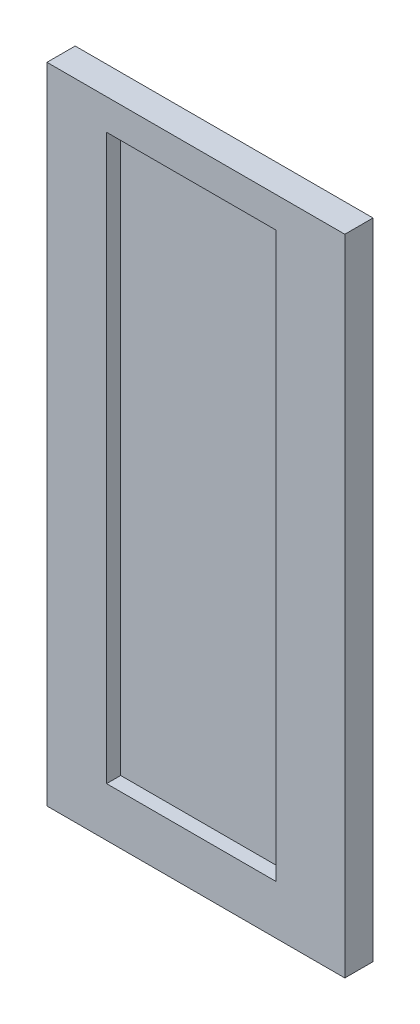
ISO-10303-21;
HEADER;
FILE_DESCRIPTION(('STEP AP214'),'2;1');
FILE_NAME('part.step','',(''),(''),'','','');
FILE_SCHEMA(('AUTOMOTIVE_DESIGN { 1 0 10303 214 1 1 1 1 }'));
ENDSEC;
DATA;
#1=APPLICATION_CONTEXT('core data for automotive mechanical design processes');
#2=APPLICATION_PROTOCOL_DEFINITION('international standard','automotive_design',2000,#1);
#3=PRODUCT_CONTEXT('',#1,'mechanical');
#4=PRODUCT('Part','Part','',(#3));
#5=PRODUCT_RELATED_PRODUCT_CATEGORY('part','',(#4));
#6=PRODUCT_DEFINITION_FORMATION('','',#4);
#7=PRODUCT_DEFINITION_CONTEXT('part definition',#1,'design');
#8=PRODUCT_DEFINITION('design','',#6,#7);
#9=PRODUCT_DEFINITION_SHAPE('','',#8);
#10=(LENGTH_UNIT() NAMED_UNIT(*) SI_UNIT(.MILLI.,.METRE.));
#11=(NAMED_UNIT(*) PLANE_ANGLE_UNIT() SI_UNIT($,.RADIAN.));
#12=(NAMED_UNIT(*) SI_UNIT($,.STERADIAN.) SOLID_ANGLE_UNIT());
#13=UNCERTAINTY_MEASURE_WITH_UNIT(LENGTH_MEASURE(1.E-05),#10,'distance_accuracy_value','');
#14=(GEOMETRIC_REPRESENTATION_CONTEXT(3) GLOBAL_UNCERTAINTY_ASSIGNED_CONTEXT((#13)) GLOBAL_UNIT_ASSIGNED_CONTEXT((#10,
#11,#12)) REPRESENTATION_CONTEXT('',''));
#15=CARTESIAN_POINT('',(0.,0.,0.));
#16=DIRECTION('',(0.,0.,1.));
#17=DIRECTION('',(1.,0.,0.));
#18=AXIS2_PLACEMENT_3D('',#15,#16,#17);
#19=CARTESIAN_POINT('',(-10.5676357049356,-108.722534952028,-5.));
#20=DIRECTION('',(-1.,0.,0.));
#21=DIRECTION('',(0.,0.,1.));
#22=AXIS2_PLACEMENT_3D('',#19,#20,#21);
#23=PLANE('',#22);
#24=DIRECTION('',(0.,-1.,0.));
#25=VECTOR('',#24,1.);
#26=CARTESIAN_POINT('',(-10.5676357049356,-108.722534952028,0.));
#27=LINE('',#26,#25);
#28=CARTESIAN_POINT('',(-10.5676357049356,5.45936548567067,0.));
#29=VERTEX_POINT('',#28);
#30=CARTESIAN_POINT('',(-10.5676357049356,-108.722534952028,0.));
#31=VERTEX_POINT('',#30);
#32=EDGE_CURVE('E150',#29,#31,#27,.T.);
#33=ORIENTED_EDGE('',*,*,#32,.F.);
#34=DIRECTION('',(0.,0.,1.));
#35=VECTOR('',#34,1.);
#36=CARTESIAN_POINT('',(-10.5676357049356,5.45936548567067,-5.));
#37=LINE('',#36,#35);
#38=CARTESIAN_POINT('',(-10.5676357049356,5.45936548567067,-5.));
#39=VERTEX_POINT('',#38);
#40=EDGE_CURVE('E11',#39,#29,#37,.T.);
#41=ORIENTED_EDGE('',*,*,#40,.F.);
#42=DIRECTION('',(0.,-1.,0.));
#43=VECTOR('',#42,1.);
#44=CARTESIAN_POINT('',(-10.5676357049356,-108.722534952028,-5.));
#45=LINE('',#44,#43);
#46=CARTESIAN_POINT('',(-10.5676357049356,-108.722534952028,-5.));
#47=VERTEX_POINT('',#46);
#48=EDGE_CURVE('E154',#39,#47,#45,.T.);
#49=ORIENTED_EDGE('',*,*,#48,.T.);
#50=DIRECTION('',(0.,0.,1.));
#51=VECTOR('',#50,1.);
#52=CARTESIAN_POINT('',(-10.5676357049356,-108.722534952028,-5.));
#53=LINE('',#52,#51);
#54=EDGE_CURVE('E45',#47,#31,#53,.T.);
#55=ORIENTED_EDGE('',*,*,#54,.T.);
#56=EDGE_LOOP('',(#33,#41,#49,#55));
#57=FACE_BOUND('',#56,.T.);
#58=ADVANCED_FACE('F42',(#57),#23,.T.);
#59=CARTESIAN_POINT('',(-10.5676357049356,5.45936548567067,-5.));
#60=DIRECTION('',(0.,1.,0.));
#61=DIRECTION('',(0.,0.,1.));
#62=AXIS2_PLACEMENT_3D('',#59,#60,#61);
#63=PLANE('',#62);
#64=DIRECTION('',(-1.,0.,0.));
#65=VECTOR('',#64,1.);
#66=CARTESIAN_POINT('',(-10.5676357049356,5.45936548567067,0.));
#67=LINE('',#66,#65);
#68=CARTESIAN_POINT('',(42.2321698369315,5.45936548567067,0.));
#69=VERTEX_POINT('',#68);
#70=EDGE_CURVE('E157',#69,#29,#67,.T.);
#71=ORIENTED_EDGE('',*,*,#70,.F.);
#72=DIRECTION('',(0.,0.,1.));
#73=VECTOR('',#72,1.);
#74=CARTESIAN_POINT('',(42.2321698369315,5.45936548567067,-5.));
#75=LINE('',#74,#73);
#76=CARTESIAN_POINT('',(42.2321698369315,5.45936548567067,-5.));
#77=VERTEX_POINT('',#76);
#78=EDGE_CURVE('E50',#77,#69,#75,.T.);
#79=ORIENTED_EDGE('',*,*,#78,.F.);
#80=DIRECTION('',(-1.,0.,0.));
#81=VECTOR('',#80,1.);
#82=CARTESIAN_POINT('',(-10.5676357049356,5.45936548567067,-5.));
#83=LINE('',#82,#81);
#84=EDGE_CURVE('E162',#77,#39,#83,.T.);
#85=ORIENTED_EDGE('',*,*,#84,.T.);
#86=ORIENTED_EDGE('',*,*,#40,.T.);
#87=EDGE_LOOP('',(#71,#79,#85,#86));
#88=FACE_BOUND('',#87,.T.);
#89=ADVANCED_FACE('F179',(#88),#63,.T.);
#90=CARTESIAN_POINT('',(42.2321698369315,5.45936548567067,-5.));
#91=DIRECTION('',(1.,0.,0.));
#92=DIRECTION('',(0.,0.,-1.));
#93=AXIS2_PLACEMENT_3D('',#90,#91,#92);
#94=PLANE('',#93);
#95=DIRECTION('',(0.,1.,0.));
#96=VECTOR('',#95,1.);
#97=CARTESIAN_POINT('',(42.2321698369315,5.45936548567067,0.));
#98=LINE('',#97,#96);
#99=CARTESIAN_POINT('',(42.2321698369315,-108.722534952028,0.));
#100=VERTEX_POINT('',#99);
#101=EDGE_CURVE('E169',#100,#69,#98,.T.);
#102=ORIENTED_EDGE('',*,*,#101,.F.);
#103=DIRECTION('',(0.,0.,1.));
#104=VECTOR('',#103,1.);
#105=CARTESIAN_POINT('',(42.2321698369315,-108.722534952028,-5.));
#106=LINE('',#105,#104);
#107=CARTESIAN_POINT('',(42.2321698369315,-108.722534952028,-5.));
#108=VERTEX_POINT('',#107);
#109=EDGE_CURVE('E174',#108,#100,#106,.T.);
#110=ORIENTED_EDGE('',*,*,#109,.F.);
#111=DIRECTION('',(0.,1.,0.));
#112=VECTOR('',#111,1.);
#113=CARTESIAN_POINT('',(42.2321698369315,5.45936548567067,-5.));
#114=LINE('',#113,#112);
#115=EDGE_CURVE('E159',#108,#77,#114,.T.);
#116=ORIENTED_EDGE('',*,*,#115,.T.);
#117=ORIENTED_EDGE('',*,*,#78,.T.);
#118=EDGE_LOOP('',(#102,#110,#116,#117));
#119=FACE_BOUND('',#118,.T.);
#120=ADVANCED_FACE('F183',(#119),#94,.T.);
#121=CARTESIAN_POINT('',(42.2321698369315,-108.722534952028,-5.));
#122=DIRECTION('',(0.,-1.,0.));
#123=DIRECTION('',(1.,0.,0.));
#124=AXIS2_PLACEMENT_3D('',#121,#122,#123);
#125=PLANE('',#124);
#126=DIRECTION('',(1.,0.,0.));
#127=VECTOR('',#126,1.);
#128=CARTESIAN_POINT('',(42.2321698369315,-108.722534952028,0.));
#129=LINE('',#128,#127);
#130=EDGE_CURVE('E166',#31,#100,#129,.T.);
#131=ORIENTED_EDGE('',*,*,#130,.F.);
#132=ORIENTED_EDGE('',*,*,#54,.F.);
#133=DIRECTION('',(1.,0.,0.));
#134=VECTOR('',#133,1.);
#135=CARTESIAN_POINT('',(42.2321698369315,-108.722534952028,-5.));
#136=LINE('',#135,#134);
#137=EDGE_CURVE('E156',#47,#108,#136,.T.);
#138=ORIENTED_EDGE('',*,*,#137,.T.);
#139=ORIENTED_EDGE('',*,*,#109,.T.);
#140=EDGE_LOOP('',(#131,#132,#138,#139));
#141=FACE_BOUND('',#140,.T.);
#142=ADVANCED_FACE('F176',(#141),#125,.T.);
#143=CARTESIAN_POINT('',(0.,0.,-5.));
#144=DIRECTION('',(0.,0.,-1.));
#145=DIRECTION('',(-1.,0.,0.));
#146=AXIS2_PLACEMENT_3D('',#143,#144,#145);
#147=PLANE('',#146);
#148=ORIENTED_EDGE('',*,*,#48,.F.);
#149=ORIENTED_EDGE('',*,*,#84,.F.);
#150=ORIENTED_EDGE('',*,*,#115,.F.);
#151=ORIENTED_EDGE('',*,*,#137,.F.);
#152=EDGE_LOOP('',(#148,#149,#150,#151));
#153=FACE_BOUND('',#152,.T.);
#154=ADVANCED_FACE('F185',(#153),#147,.T.);
#155=CARTESIAN_POINT('',(0.,0.,0.));
#156=DIRECTION('',(0.,0.,-1.));
#157=DIRECTION('',(-1.,0.,0.));
#158=AXIS2_PLACEMENT_3D('',#155,#156,#157);
#159=PLANE('',#158);
#160=DIRECTION('',(1.,0.,0.));
#161=VECTOR('',#160,1.);
#162=CARTESIAN_POINT('',(30.0000000000011,-99.9999999999998,0.));
#163=LINE('',#162,#161);
#164=CARTESIAN_POINT('',(1.13686838048077E-12,-100.,0.));
#165=VERTEX_POINT('',#164);
#166=CARTESIAN_POINT('',(30.0000000000011,-99.9999999999998,0.));
#167=VERTEX_POINT('',#166);
#168=EDGE_CURVE('E144',#165,#167,#163,.T.);
#169=ORIENTED_EDGE('',*,*,#168,.F.);
#170=DIRECTION('',(0.,-1.,0.));
#171=VECTOR('',#170,1.);
#172=CARTESIAN_POINT('',(1.13686837721616E-12,-100.,0.));
#173=LINE('',#172,#171);
#174=CARTESIAN_POINT('',(2.27373675443232E-13,-1.13686837721616E-13,0.));
#175=VERTEX_POINT('',#174);
#176=EDGE_CURVE('E58',#175,#165,#173,.T.);
#177=ORIENTED_EDGE('',*,*,#176,.F.);
#178=DIRECTION('',(-1.,0.,0.));
#179=VECTOR('',#178,1.);
#180=CARTESIAN_POINT('',(2.27373675443232E-13,-1.13686837721616E-13,0.));
#181=LINE('',#180,#179);
#182=CARTESIAN_POINT('',(30.0000000000002,2.27373675443232E-13,0.));
#183=VERTEX_POINT('',#182);
#184=EDGE_CURVE('E135',#183,#175,#181,.T.);
#185=ORIENTED_EDGE('',*,*,#184,.F.);
#186=DIRECTION('',(0.,1.,0.));
#187=VECTOR('',#186,1.);
#188=CARTESIAN_POINT('',(30.0000000000002,2.27373675443232E-13,0.));
#189=LINE('',#188,#187);
#190=EDGE_CURVE('E138',#167,#183,#189,.T.);
#191=ORIENTED_EDGE('',*,*,#190,.F.);
#192=EDGE_LOOP('',(#169,#177,#185,#191));
#193=FACE_BOUND('',#192,.T.);
#194=ORIENTED_EDGE('',*,*,#32,.T.);
#195=ORIENTED_EDGE('',*,*,#130,.T.);
#196=ORIENTED_EDGE('',*,*,#101,.T.);
#197=ORIENTED_EDGE('',*,*,#70,.T.);
#198=EDGE_LOOP('',(#194,#195,#196,#197));
#199=FACE_BOUND('',#198,.T.);
#200=ADVANCED_FACE('F178',(#193,#199),#159,.F.);
#201=CARTESIAN_POINT('',(1.13686837721616E-12,-100.,-2.5));
#202=DIRECTION('',(-1.,0.,0.));
#203=DIRECTION('',(0.,-1.,0.));
#204=AXIS2_PLACEMENT_3D('',#201,#202,#203);
#205=PLANE('',#204);
#206=ORIENTED_EDGE('',*,*,#176,.T.);
#207=DIRECTION('',(0.,0.,1.));
#208=VECTOR('',#207,1.);
#209=CARTESIAN_POINT('',(1.13686837721616E-12,-100.,-2.5));
#210=LINE('',#209,#208);
#211=CARTESIAN_POINT('',(1.13686837721616E-12,-100.,-2.5));
#212=VERTEX_POINT('',#211);
#213=EDGE_CURVE('E112',#212,#165,#210,.T.);
#214=ORIENTED_EDGE('',*,*,#213,.F.);
#215=DIRECTION('',(0.,-1.,0.));
#216=VECTOR('',#215,1.);
#217=CARTESIAN_POINT('',(1.13686837721616E-12,-100.,-2.5));
#218=LINE('',#217,#216);
#219=CARTESIAN_POINT('',(2.27373675443232E-13,-1.13686837721616E-13,-2.5));
#220=VERTEX_POINT('',#219);
#221=EDGE_CURVE('E116',#220,#212,#218,.T.);
#222=ORIENTED_EDGE('',*,*,#221,.F.);
#223=DIRECTION('',(0.,0.,1.));
#224=VECTOR('',#223,1.);
#225=CARTESIAN_POINT('',(2.27373675443232E-13,-1.13686837721616E-13,-2.5));
#226=LINE('',#225,#224);
#227=EDGE_CURVE('E148',#220,#175,#226,.T.);
#228=ORIENTED_EDGE('',*,*,#227,.T.);
#229=EDGE_LOOP('',(#206,#214,#222,#228));
#230=FACE_BOUND('',#229,.T.);
#231=ADVANCED_FACE('F114',(#230),#205,.F.);
#232=CARTESIAN_POINT('',(2.27373675443232E-13,-1.13686837721616E-13,-2.5));
#233=DIRECTION('',(0.,1.,0.));
#234=DIRECTION('',(-1.,0.,0.));
#235=AXIS2_PLACEMENT_3D('',#232,#233,#234);
#236=PLANE('',#235);
#237=ORIENTED_EDGE('',*,*,#184,.T.);
#238=ORIENTED_EDGE('',*,*,#227,.F.);
#239=DIRECTION('',(-1.,0.,0.));
#240=VECTOR('',#239,1.);
#241=CARTESIAN_POINT('',(2.27373675443232E-13,-1.13686837721616E-13,-2.5));
#242=LINE('',#241,#240);
#243=CARTESIAN_POINT('',(30.0000000000002,2.27373675443232E-13,-2.5));
#244=VERTEX_POINT('',#243);
#245=EDGE_CURVE('E122',#244,#220,#242,.T.);
#246=ORIENTED_EDGE('',*,*,#245,.F.);
#247=DIRECTION('',(0.,0.,1.));
#248=VECTOR('',#247,1.);
#249=CARTESIAN_POINT('',(30.0000000000002,2.27373675443232E-13,-2.5));
#250=LINE('',#249,#248);
#251=EDGE_CURVE('E151',#244,#183,#250,.T.);
#252=ORIENTED_EDGE('',*,*,#251,.T.);
#253=EDGE_LOOP('',(#237,#238,#246,#252));
#254=FACE_BOUND('',#253,.T.);
#255=ADVANCED_FACE('F231',(#254),#236,.F.);
#256=CARTESIAN_POINT('',(30.0000000000002,2.27373675443232E-13,-2.5));
#257=DIRECTION('',(1.,0.,0.));
#258=DIRECTION('',(0.,1.,0.));
#259=AXIS2_PLACEMENT_3D('',#256,#257,#258);
#260=PLANE('',#259);
#261=ORIENTED_EDGE('',*,*,#190,.T.);
#262=ORIENTED_EDGE('',*,*,#251,.F.);
#263=DIRECTION('',(0.,1.,0.));
#264=VECTOR('',#263,1.);
#265=CARTESIAN_POINT('',(30.0000000000002,2.27373675443232E-13,-2.5));
#266=LINE('',#265,#264);
#267=CARTESIAN_POINT('',(30.0000000000011,-99.9999999999998,-2.5));
#268=VERTEX_POINT('',#267);
#269=EDGE_CURVE('E130',#268,#244,#266,.T.);
#270=ORIENTED_EDGE('',*,*,#269,.F.);
#271=DIRECTION('',(0.,0.,1.));
#272=VECTOR('',#271,1.);
#273=CARTESIAN_POINT('',(30.0000000000011,-99.9999999999998,-2.5));
#274=LINE('',#273,#272);
#275=EDGE_CURVE('E121',#268,#167,#274,.T.);
#276=ORIENTED_EDGE('',*,*,#275,.T.);
#277=EDGE_LOOP('',(#261,#262,#270,#276));
#278=FACE_BOUND('',#277,.T.);
#279=ADVANCED_FACE('F239',(#278),#260,.F.);
#280=CARTESIAN_POINT('',(30.0000000000011,-99.9999999999998,-2.5));
#281=DIRECTION('',(0.,-1.,0.));
#282=DIRECTION('',(1.,0.,0.));
#283=AXIS2_PLACEMENT_3D('',#280,#281,#282);
#284=PLANE('',#283);
#285=ORIENTED_EDGE('',*,*,#168,.T.);
#286=ORIENTED_EDGE('',*,*,#275,.F.);
#287=DIRECTION('',(1.,0.,0.));
#288=VECTOR('',#287,1.);
#289=CARTESIAN_POINT('',(30.0000000000011,-99.9999999999998,-2.5));
#290=LINE('',#289,#288);
#291=EDGE_CURVE('E125',#212,#268,#290,.T.);
#292=ORIENTED_EDGE('',*,*,#291,.F.);
#293=ORIENTED_EDGE('',*,*,#213,.T.);
#294=EDGE_LOOP('',(#285,#286,#292,#293));
#295=FACE_BOUND('',#294,.T.);
#296=ADVANCED_FACE('F126',(#295),#284,.F.);
#297=CARTESIAN_POINT('',(0.,0.,-2.5));
#298=DIRECTION('',(0.,0.,-1.));
#299=DIRECTION('',(-1.,0.,0.));
#300=AXIS2_PLACEMENT_3D('',#297,#298,#299);
#301=PLANE('',#300);
#302=ORIENTED_EDGE('',*,*,#221,.T.);
#303=ORIENTED_EDGE('',*,*,#291,.T.);
#304=ORIENTED_EDGE('',*,*,#269,.T.);
#305=ORIENTED_EDGE('',*,*,#245,.T.);
#306=EDGE_LOOP('',(#302,#303,#304,#305));
#307=FACE_BOUND('',#306,.T.);
#308=ADVANCED_FACE('F133',(#307),#301,.F.);
#309=CLOSED_SHELL('',(#58,#89,#120,#142,#154,#200,#231,#255,#279,#296,#308));
#310=MANIFOLD_SOLID_BREP('B2',#309);
#311=ADVANCED_BREP_SHAPE_REPRESENTATION('',(#18,#310),#14);
#312=SHAPE_DEFINITION_REPRESENTATION(#9,#311);
ENDSEC;
END-ISO-10303-21;
